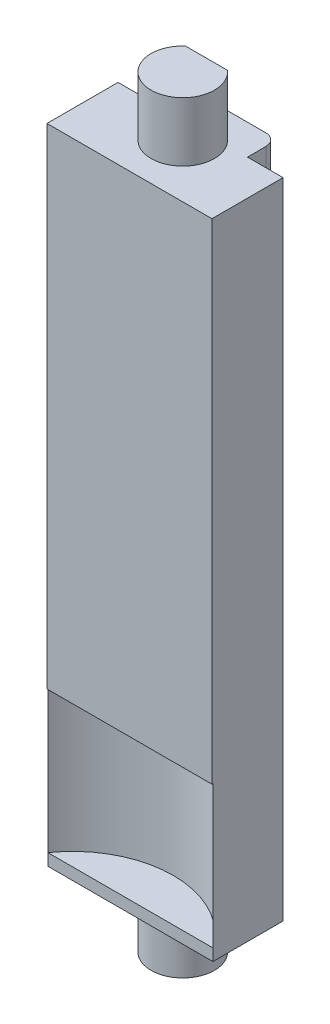
ISO-10303-21;
HEADER;
FILE_DESCRIPTION(('STEP AP214'),'2;1');
FILE_NAME('part.step','',(''),(''),'','','');
FILE_SCHEMA(('AUTOMOTIVE_DESIGN { 1 0 10303 214 1 1 1 1 }'));
ENDSEC;
DATA;
#1=APPLICATION_CONTEXT('core data for automotive mechanical design processes');
#2=APPLICATION_PROTOCOL_DEFINITION('international standard','automotive_design',2000,#1);
#3=PRODUCT_CONTEXT('',#1,'mechanical');
#4=PRODUCT('Part','Part','',(#3));
#5=PRODUCT_RELATED_PRODUCT_CATEGORY('part','',(#4));
#6=PRODUCT_DEFINITION_FORMATION('','',#4);
#7=PRODUCT_DEFINITION_CONTEXT('part definition',#1,'design');
#8=PRODUCT_DEFINITION('design','',#6,#7);
#9=PRODUCT_DEFINITION_SHAPE('','',#8);
#10=(LENGTH_UNIT() NAMED_UNIT(*) SI_UNIT(.MILLI.,.METRE.));
#11=(NAMED_UNIT(*) PLANE_ANGLE_UNIT() SI_UNIT($,.RADIAN.));
#12=(NAMED_UNIT(*) SI_UNIT($,.STERADIAN.) SOLID_ANGLE_UNIT());
#13=UNCERTAINTY_MEASURE_WITH_UNIT(LENGTH_MEASURE(1.E-05),#10,'distance_accuracy_value','');
#14=(GEOMETRIC_REPRESENTATION_CONTEXT(3) GLOBAL_UNCERTAINTY_ASSIGNED_CONTEXT((#13)) GLOBAL_UNIT_ASSIGNED_CONTEXT((#10,
#11,#12)) REPRESENTATION_CONTEXT('',''));
#15=CARTESIAN_POINT('',(0.,0.,0.));
#16=DIRECTION('',(0.,0.,1.));
#17=DIRECTION('',(1.,0.,0.));
#18=AXIS2_PLACEMENT_3D('',#15,#16,#17);
#19=CARTESIAN_POINT('',(0.,54.32,8.55));
#20=DIRECTION('',(0.,0.,-1.));
#21=DIRECTION('',(-1.,0.,0.));
#22=AXIS2_PLACEMENT_3D('',#19,#20,#21);
#23=PLANE('',#22);
#24=DIRECTION('',(-1.,0.,0.));
#25=VECTOR('',#24,1.);
#26=CARTESIAN_POINT('',(0.,13.,8.55));
#27=LINE('',#26,#25);
#28=CARTESIAN_POINT('',(10.92,13.,8.55));
#29=VERTEX_POINT('',#28);
#30=CARTESIAN_POINT('',(-3.,13.,8.55));
#31=VERTEX_POINT('',#30);
#32=EDGE_CURVE('E186',#29,#31,#27,.T.);
#33=ORIENTED_EDGE('',*,*,#32,.F.);
#34=DIRECTION('',(0.,-1.,0.));
#35=VECTOR('',#34,1.);
#36=CARTESIAN_POINT('',(10.92,54.32,8.55));
#37=LINE('',#36,#35);
#38=CARTESIAN_POINT('',(10.92,54.32,8.55));
#39=VERTEX_POINT('',#38);
#40=EDGE_CURVE('E254',#39,#29,#37,.T.);
#41=ORIENTED_EDGE('',*,*,#40,.F.);
#42=DIRECTION('',(1.,0.,0.));
#43=VECTOR('',#42,1.);
#44=CARTESIAN_POINT('',(0.,54.32,8.55));
#45=LINE('',#44,#43);
#46=CARTESIAN_POINT('',(-3.,54.32,8.55));
#47=VERTEX_POINT('',#46);
#48=EDGE_CURVE('E236',#47,#39,#45,.T.);
#49=ORIENTED_EDGE('',*,*,#48,.F.);
#50=DIRECTION('',(0.,-1.,0.));
#51=VECTOR('',#50,1.);
#52=CARTESIAN_POINT('',(-3.,54.32,8.55));
#53=LINE('',#52,#51);
#54=EDGE_CURVE('E257',#47,#31,#53,.T.);
#55=ORIENTED_EDGE('',*,*,#54,.T.);
#56=EDGE_LOOP('',(#33,#41,#49,#55));
#57=FACE_BOUND('',#56,.T.);
#58=ADVANCED_FACE('F37',(#57),#23,.F.);
#59=CARTESIAN_POINT('',(0.,0.,0.));
#60=DIRECTION('',(0.,1.,0.));
#61=DIRECTION('',(0.,0.,1.));
#62=AXIS2_PLACEMENT_3D('',#59,#60,#61);
#63=PLANE('',#62);
#64=CARTESIAN_POINT('',(3.96,0.,4.05));
#65=DIRECTION('',(0.,1.,0.));
#66=DIRECTION('',(0.,0.,1.));
#67=AXIS2_PLACEMENT_3D('',#64,#65,#66);
#68=CIRCLE('',#67,2.675);
#69=CARTESIAN_POINT('',(2.18359210765095,0.,2.05));
#70=VERTEX_POINT('',#69);
#71=CARTESIAN_POINT('',(5.73640789234905,0.,2.05));
#72=VERTEX_POINT('',#71);
#73=EDGE_CURVE('E196',#70,#72,#68,.T.);
#74=ORIENTED_EDGE('',*,*,#73,.T.);
#75=DIRECTION('',(1.,0.,0.));
#76=VECTOR('',#75,1.);
#77=CARTESIAN_POINT('',(0.,0.,2.05));
#78=LINE('',#77,#76);
#79=EDGE_CURVE('E192',#70,#72,#78,.T.);
#80=ORIENTED_EDGE('',*,*,#79,.F.);
#81=EDGE_LOOP('',(#74,#80));
#82=FACE_BOUND('',#81,.T.);
#83=DIRECTION('',(0.,0.,-1.));
#84=VECTOR('',#83,1.);
#85=CARTESIAN_POINT('',(10.92,0.,0.));
#86=LINE('',#85,#84);
#87=CARTESIAN_POINT('',(10.92,0.,8.46909948526199));
#88=VERTEX_POINT('',#87);
#89=CARTESIAN_POINT('',(10.92,0.,2.55));
#90=VERTEX_POINT('',#89);
#91=EDGE_CURVE('E154',#88,#90,#86,.T.);
#92=ORIENTED_EDGE('',*,*,#91,.F.);
#93=DIRECTION('',(1.,0.,0.));
#94=VECTOR('',#93,1.);
#95=CARTESIAN_POINT('',(-3.,0.,8.46909948526199));
#96=LINE('',#95,#94);
#97=CARTESIAN_POINT('',(-3.,0.,8.46909948526199));
#98=VERTEX_POINT('',#97);
#99=EDGE_CURVE('E159',#98,#88,#96,.T.);
#100=ORIENTED_EDGE('',*,*,#99,.F.);
#101=DIRECTION('',(0.,0.,1.));
#102=VECTOR('',#101,1.);
#103=CARTESIAN_POINT('',(-3.,0.,0.));
#104=LINE('',#103,#102);
#105=CARTESIAN_POINT('',(-3.,0.,2.55));
#106=VERTEX_POINT('',#105);
#107=EDGE_CURVE('E165',#106,#98,#104,.T.);
#108=ORIENTED_EDGE('',*,*,#107,.F.);
#109=DIRECTION('',(-1.,0.,0.));
#110=VECTOR('',#109,1.);
#111=CARTESIAN_POINT('',(0.,0.,2.55));
#112=LINE('',#111,#110);
#113=CARTESIAN_POINT('',(0.,0.,2.55));
#114=VERTEX_POINT('',#113);
#115=EDGE_CURVE('E246',#114,#106,#112,.T.);
#116=ORIENTED_EDGE('',*,*,#115,.F.);
#117=DIRECTION('',(0.,0.,1.));
#118=VECTOR('',#117,1.);
#119=CARTESIAN_POINT('',(0.,0.,0.));
#120=LINE('',#119,#118);
#121=CARTESIAN_POINT('',(0.,0.,1.));
#122=VERTEX_POINT('',#121);
#123=EDGE_CURVE('E244',#122,#114,#120,.T.);
#124=ORIENTED_EDGE('',*,*,#123,.F.);
#125=CARTESIAN_POINT('',(1.,0.,1.));
#126=DIRECTION('',(0.,1.,0.));
#127=DIRECTION('',(0.,0.,1.));
#128=AXIS2_PLACEMENT_3D('',#125,#126,#127);
#129=CIRCLE('',#128,1.);
#130=CARTESIAN_POINT('',(1.,0.,0.));
#131=VERTEX_POINT('',#130);
#132=EDGE_CURVE('E271',#122,#131,#129,.F.);
#133=ORIENTED_EDGE('',*,*,#132,.T.);
#134=DIRECTION('',(1.,0.,0.));
#135=VECTOR('',#134,1.);
#136=CARTESIAN_POINT('',(0.,0.,0.));
#137=LINE('',#136,#135);
#138=CARTESIAN_POINT('',(6.92,0.,0.));
#139=VERTEX_POINT('',#138);
#140=EDGE_CURVE('E241',#131,#139,#137,.T.);
#141=ORIENTED_EDGE('',*,*,#140,.T.);
#142=CARTESIAN_POINT('',(6.92,0.,1.));
#143=DIRECTION('',(0.,1.,0.));
#144=DIRECTION('',(0.,0.,1.));
#145=AXIS2_PLACEMENT_3D('',#142,#143,#144);
#146=CIRCLE('',#145,1.);
#147=CARTESIAN_POINT('',(7.92,0.,1.));
#148=VERTEX_POINT('',#147);
#149=EDGE_CURVE('E273',#139,#148,#146,.F.);
#150=ORIENTED_EDGE('',*,*,#149,.T.);
#151=DIRECTION('',(0.,0.,1.));
#152=VECTOR('',#151,1.);
#153=CARTESIAN_POINT('',(7.92,0.,0.));
#154=LINE('',#153,#152);
#155=CARTESIAN_POINT('',(7.92,0.,2.55));
#156=VERTEX_POINT('',#155);
#157=EDGE_CURVE('E223',#148,#156,#154,.T.);
#158=ORIENTED_EDGE('',*,*,#157,.T.);
#159=EDGE_CURVE('E161',#90,#156,#112,.T.);
#160=ORIENTED_EDGE('',*,*,#159,.F.);
#161=EDGE_LOOP('',(#92,#100,#108,#116,#124,#133,#141,#150,#158,#160));
#162=FACE_BOUND('',#161,.T.);
#163=ADVANCED_FACE('F156',(#82,#162),#63,.F.);
#164=CARTESIAN_POINT('',(7.92,54.32,0.));
#165=DIRECTION('',(1.,0.,0.));
#166=DIRECTION('',(0.,0.,-1.));
#167=AXIS2_PLACEMENT_3D('',#164,#165,#166);
#168=PLANE('',#167);
#169=ORIENTED_EDGE('',*,*,#157,.F.);
#170=DIRECTION('',(0.,-1.,0.));
#171=VECTOR('',#170,1.);
#172=CARTESIAN_POINT('',(7.92,54.32,1.));
#173=LINE('',#172,#171);
#174=CARTESIAN_POINT('',(7.92,54.32,1.));
#175=VERTEX_POINT('',#174);
#176=EDGE_CURVE('E275',#148,#175,#173,.F.);
#177=ORIENTED_EDGE('',*,*,#176,.T.);
#178=DIRECTION('',(0.,0.,1.));
#179=VECTOR('',#178,1.);
#180=CARTESIAN_POINT('',(7.92,54.32,0.));
#181=LINE('',#180,#179);
#182=CARTESIAN_POINT('',(7.92,54.32,2.55));
#183=VERTEX_POINT('',#182);
#184=EDGE_CURVE('E224',#175,#183,#181,.T.);
#185=ORIENTED_EDGE('',*,*,#184,.T.);
#186=DIRECTION('',(0.,-1.,0.));
#187=VECTOR('',#186,1.);
#188=CARTESIAN_POINT('',(7.92,54.32,2.55));
#189=LINE('',#188,#187);
#190=EDGE_CURVE('E249',#183,#156,#189,.T.);
#191=ORIENTED_EDGE('',*,*,#190,.T.);
#192=EDGE_LOOP('',(#169,#177,#185,#191));
#193=FACE_BOUND('',#192,.T.);
#194=ADVANCED_FACE('F320',(#193),#168,.T.);
#195=CARTESIAN_POINT('',(0.,54.32,0.));
#196=DIRECTION('',(0.,0.,-1.));
#197=DIRECTION('',(-1.,0.,0.));
#198=AXIS2_PLACEMENT_3D('',#195,#196,#197);
#199=PLANE('',#198);
#200=DIRECTION('',(1.,0.,0.));
#201=VECTOR('',#200,1.);
#202=CARTESIAN_POINT('',(0.,54.32,0.));
#203=LINE('',#202,#201);
#204=CARTESIAN_POINT('',(1.,54.32,0.));
#205=VERTEX_POINT('',#204);
#206=CARTESIAN_POINT('',(6.92,54.32,0.));
#207=VERTEX_POINT('',#206);
#208=EDGE_CURVE('E226',#205,#207,#203,.T.);
#209=ORIENTED_EDGE('',*,*,#208,.T.);
#210=DIRECTION('',(0.,-1.,0.));
#211=VECTOR('',#210,1.);
#212=CARTESIAN_POINT('',(6.92,54.32,0.));
#213=LINE('',#212,#211);
#214=EDGE_CURVE('E268',#207,#139,#213,.T.);
#215=ORIENTED_EDGE('',*,*,#214,.T.);
#216=ORIENTED_EDGE('',*,*,#140,.F.);
#217=DIRECTION('',(0.,-1.,0.));
#218=VECTOR('',#217,1.);
#219=CARTESIAN_POINT('',(1.,54.32,0.));
#220=LINE('',#219,#218);
#221=EDGE_CURVE('E266',#131,#205,#220,.F.);
#222=ORIENTED_EDGE('',*,*,#221,.T.);
#223=EDGE_LOOP('',(#209,#215,#216,#222));
#224=FACE_BOUND('',#223,.T.);
#225=ADVANCED_FACE('F332',(#224),#199,.T.);
#226=CARTESIAN_POINT('',(0.,54.32,0.));
#227=DIRECTION('',(1.,0.,0.));
#228=DIRECTION('',(0.,0.,-1.));
#229=AXIS2_PLACEMENT_3D('',#226,#227,#228);
#230=PLANE('',#229);
#231=DIRECTION('',(0.,0.,1.));
#232=VECTOR('',#231,1.);
#233=CARTESIAN_POINT('',(0.,54.32,0.));
#234=LINE('',#233,#232);
#235=CARTESIAN_POINT('',(0.,54.32,1.));
#236=VERTEX_POINT('',#235);
#237=CARTESIAN_POINT('',(0.,54.32,2.55));
#238=VERTEX_POINT('',#237);
#239=EDGE_CURVE('E229',#236,#238,#234,.T.);
#240=ORIENTED_EDGE('',*,*,#239,.F.);
#241=DIRECTION('',(0.,-1.,0.));
#242=VECTOR('',#241,1.);
#243=CARTESIAN_POINT('',(0.,0.,1.));
#244=LINE('',#243,#242);
#245=EDGE_CURVE('E281',#236,#122,#244,.T.);
#246=ORIENTED_EDGE('',*,*,#245,.T.);
#247=ORIENTED_EDGE('',*,*,#123,.T.);
#248=DIRECTION('',(0.,-1.,0.));
#249=VECTOR('',#248,1.);
#250=CARTESIAN_POINT('',(0.,54.32,2.55));
#251=LINE('',#250,#249);
#252=EDGE_CURVE('E263',#238,#114,#251,.T.);
#253=ORIENTED_EDGE('',*,*,#252,.F.);
#254=EDGE_LOOP('',(#240,#246,#247,#253));
#255=FACE_BOUND('',#254,.T.);
#256=ADVANCED_FACE('F329',(#255),#230,.F.);
#257=CARTESIAN_POINT('',(0.,54.32,2.55));
#258=DIRECTION('',(0.,0.,1.));
#259=DIRECTION('',(1.,0.,0.));
#260=AXIS2_PLACEMENT_3D('',#257,#258,#259);
#261=PLANE('',#260);
#262=ORIENTED_EDGE('',*,*,#115,.T.);
#263=DIRECTION('',(0.,-1.,0.));
#264=VECTOR('',#263,1.);
#265=CARTESIAN_POINT('',(-3.,54.32,2.55));
#266=LINE('',#265,#264);
#267=CARTESIAN_POINT('',(-3.,54.32,2.55));
#268=VERTEX_POINT('',#267);
#269=EDGE_CURVE('E260',#268,#106,#266,.T.);
#270=ORIENTED_EDGE('',*,*,#269,.F.);
#271=DIRECTION('',(-1.,0.,0.));
#272=VECTOR('',#271,1.);
#273=CARTESIAN_POINT('',(0.,54.32,2.55));
#274=LINE('',#273,#272);
#275=EDGE_CURVE('E231',#238,#268,#274,.T.);
#276=ORIENTED_EDGE('',*,*,#275,.F.);
#277=ORIENTED_EDGE('',*,*,#252,.T.);
#278=EDGE_LOOP('',(#262,#270,#276,#277));
#279=FACE_BOUND('',#278,.T.);
#280=ADVANCED_FACE('F328',(#279),#261,.F.);
#281=CARTESIAN_POINT('',(-3.,54.32,0.));
#282=DIRECTION('',(1.,0.,0.));
#283=DIRECTION('',(0.,0.,-1.));
#284=AXIS2_PLACEMENT_3D('',#281,#282,#283);
#285=PLANE('',#284);
#286=ORIENTED_EDGE('',*,*,#107,.T.);
#287=DIRECTION('',(0.,-1.,0.));
#288=VECTOR('',#287,1.);
#289=CARTESIAN_POINT('',(-3.,13.,8.46909948526199));
#290=LINE('',#289,#288);
#291=CARTESIAN_POINT('',(-3.,1.,8.46909948526199));
#292=VERTEX_POINT('',#291);
#293=EDGE_CURVE('E179',#98,#292,#290,.F.);
#294=ORIENTED_EDGE('',*,*,#293,.T.);
#295=CARTESIAN_POINT('',(-3.,13.,8.46909948526199));
#296=VERTEX_POINT('',#295);
#297=EDGE_CURVE('E52',#292,#296,#290,.F.);
#298=ORIENTED_EDGE('',*,*,#297,.T.);
#299=DIRECTION('',(0.,0.,-1.));
#300=VECTOR('',#299,1.);
#301=CARTESIAN_POINT('',(-3.,13.,0.));
#302=LINE('',#301,#300);
#303=EDGE_CURVE('E188',#31,#296,#302,.T.);
#304=ORIENTED_EDGE('',*,*,#303,.F.);
#305=ORIENTED_EDGE('',*,*,#54,.F.);
#306=DIRECTION('',(0.,0.,1.));
#307=VECTOR('',#306,1.);
#308=CARTESIAN_POINT('',(-3.,54.32,0.));
#309=LINE('',#308,#307);
#310=EDGE_CURVE('E233',#268,#47,#309,.T.);
#311=ORIENTED_EDGE('',*,*,#310,.F.);
#312=ORIENTED_EDGE('',*,*,#269,.T.);
#313=EDGE_LOOP('',(#286,#294,#298,#304,#305,#311,#312));
#314=FACE_BOUND('',#313,.T.);
#315=ADVANCED_FACE('F302',(#314),#285,.F.);
#316=CARTESIAN_POINT('',(10.92,54.32,0.));
#317=DIRECTION('',(-1.,0.,0.));
#318=DIRECTION('',(0.,0.,1.));
#319=AXIS2_PLACEMENT_3D('',#316,#317,#318);
#320=PLANE('',#319);
#321=DIRECTION('',(0.,0.,1.));
#322=VECTOR('',#321,1.);
#323=CARTESIAN_POINT('',(10.92,13.,0.));
#324=LINE('',#323,#322);
#325=CARTESIAN_POINT('',(10.92,13.,8.46909948526199));
#326=VERTEX_POINT('',#325);
#327=EDGE_CURVE('E45',#326,#29,#324,.T.);
#328=ORIENTED_EDGE('',*,*,#327,.F.);
#329=DIRECTION('',(0.,-1.,0.));
#330=VECTOR('',#329,1.);
#331=CARTESIAN_POINT('',(10.92,13.,8.46909948526199));
#332=LINE('',#331,#330);
#333=CARTESIAN_POINT('',(10.92,1.,8.46909948526199));
#334=VERTEX_POINT('',#333);
#335=EDGE_CURVE('E11',#326,#334,#332,.T.);
#336=ORIENTED_EDGE('',*,*,#335,.T.);
#337=DIRECTION('',(0.,-1.,0.));
#338=VECTOR('',#337,1.);
#339=CARTESIAN_POINT('',(10.92,1.,8.46909948526199));
#340=LINE('',#339,#338);
#341=EDGE_CURVE('E168',#334,#88,#340,.T.);
#342=ORIENTED_EDGE('',*,*,#341,.T.);
#343=ORIENTED_EDGE('',*,*,#91,.T.);
#344=DIRECTION('',(0.,-1.,0.));
#345=VECTOR('',#344,1.);
#346=CARTESIAN_POINT('',(10.92,54.32,2.55));
#347=LINE('',#346,#345);
#348=CARTESIAN_POINT('',(10.92,54.32,2.55));
#349=VERTEX_POINT('',#348);
#350=EDGE_CURVE('E252',#349,#90,#347,.T.);
#351=ORIENTED_EDGE('',*,*,#350,.F.);
#352=DIRECTION('',(0.,0.,-1.));
#353=VECTOR('',#352,1.);
#354=CARTESIAN_POINT('',(10.92,54.32,0.));
#355=LINE('',#354,#353);
#356=EDGE_CURVE('E238',#39,#349,#355,.T.);
#357=ORIENTED_EDGE('',*,*,#356,.F.);
#358=ORIENTED_EDGE('',*,*,#40,.T.);
#359=EDGE_LOOP('',(#328,#336,#342,#343,#351,#357,#358));
#360=FACE_BOUND('',#359,.T.);
#361=ADVANCED_FACE('F170',(#360),#320,.F.);
#362=ORIENTED_EDGE('',*,*,#159,.T.);
#363=ORIENTED_EDGE('',*,*,#190,.F.);
#364=EDGE_CURVE('E234',#349,#183,#274,.T.);
#365=ORIENTED_EDGE('',*,*,#364,.F.);
#366=ORIENTED_EDGE('',*,*,#350,.T.);
#367=EDGE_LOOP('',(#362,#363,#365,#366));
#368=FACE_BOUND('',#367,.T.);
#369=ADVANCED_FACE('F348',(#368),#261,.F.);
#370=CARTESIAN_POINT('',(0.,54.32,0.));
#371=DIRECTION('',(0.,1.,0.));
#372=DIRECTION('',(0.,0.,1.));
#373=AXIS2_PLACEMENT_3D('',#370,#371,#372);
#374=PLANE('',#373);
#375=DIRECTION('',(1.,0.,0.));
#376=VECTOR('',#375,1.);
#377=CARTESIAN_POINT('',(0.,54.32,2.05));
#378=LINE('',#377,#376);
#379=CARTESIAN_POINT('',(2.18359210765095,54.32,2.05));
#380=VERTEX_POINT('',#379);
#381=CARTESIAN_POINT('',(5.73640789234905,54.32,2.05));
#382=VERTEX_POINT('',#381);
#383=EDGE_CURVE('E207',#380,#382,#378,.T.);
#384=ORIENTED_EDGE('',*,*,#383,.T.);
#385=CARTESIAN_POINT('',(3.96,54.32,4.05));
#386=DIRECTION('',(0.,1.,0.));
#387=DIRECTION('',(0.,0.,1.));
#388=AXIS2_PLACEMENT_3D('',#385,#386,#387);
#389=CIRCLE('',#388,2.675);
#390=EDGE_CURVE('E212',#380,#382,#389,.T.);
#391=ORIENTED_EDGE('',*,*,#390,.F.);
#392=EDGE_LOOP('',(#384,#391));
#393=FACE_BOUND('',#392,.T.);
#394=ORIENTED_EDGE('',*,*,#184,.F.);
#395=CARTESIAN_POINT('',(6.92,54.32,1.));
#396=DIRECTION('',(0.,1.,0.));
#397=DIRECTION('',(0.,0.,1.));
#398=AXIS2_PLACEMENT_3D('',#395,#396,#397);
#399=CIRCLE('',#398,1.);
#400=EDGE_CURVE('E279',#175,#207,#399,.T.);
#401=ORIENTED_EDGE('',*,*,#400,.T.);
#402=ORIENTED_EDGE('',*,*,#208,.F.);
#403=CARTESIAN_POINT('',(1.,54.32,1.));
#404=DIRECTION('',(0.,1.,0.));
#405=DIRECTION('',(0.,0.,1.));
#406=AXIS2_PLACEMENT_3D('',#403,#404,#405);
#407=CIRCLE('',#406,1.);
#408=EDGE_CURVE('E277',#205,#236,#407,.T.);
#409=ORIENTED_EDGE('',*,*,#408,.T.);
#410=ORIENTED_EDGE('',*,*,#239,.T.);
#411=ORIENTED_EDGE('',*,*,#275,.T.);
#412=ORIENTED_EDGE('',*,*,#310,.T.);
#413=ORIENTED_EDGE('',*,*,#48,.T.);
#414=ORIENTED_EDGE('',*,*,#356,.T.);
#415=ORIENTED_EDGE('',*,*,#364,.T.);
#416=EDGE_LOOP('',(#394,#401,#402,#409,#410,#411,#412,#413,#414,#415));
#417=FACE_BOUND('',#416,.T.);
#418=ADVANCED_FACE('F296',(#393,#417),#374,.T.);
#419=CARTESIAN_POINT('',(6.92,54.32,1.));
#420=DIRECTION('',(0.,-1.,0.));
#421=DIRECTION('',(0.,0.,-1.));
#422=AXIS2_PLACEMENT_3D('',#419,#420,#421);
#423=CYLINDRICAL_SURFACE('',#422,1.);
#424=ORIENTED_EDGE('',*,*,#400,.F.);
#425=ORIENTED_EDGE('',*,*,#176,.F.);
#426=ORIENTED_EDGE('',*,*,#149,.F.);
#427=ORIENTED_EDGE('',*,*,#214,.F.);
#428=EDGE_LOOP('',(#424,#425,#426,#427));
#429=FACE_BOUND('',#428,.T.);
#430=ADVANCED_FACE('F339',(#429),#423,.T.);
#431=CARTESIAN_POINT('',(1.,54.32,1.));
#432=DIRECTION('',(0.,1.,0.));
#433=DIRECTION('',(0.,0.,1.));
#434=AXIS2_PLACEMENT_3D('',#431,#432,#433);
#435=CYLINDRICAL_SURFACE('',#434,1.);
#436=ORIENTED_EDGE('',*,*,#408,.F.);
#437=ORIENTED_EDGE('',*,*,#221,.F.);
#438=ORIENTED_EDGE('',*,*,#132,.F.);
#439=ORIENTED_EDGE('',*,*,#245,.F.);
#440=EDGE_LOOP('',(#436,#437,#438,#439));
#441=FACE_BOUND('',#440,.T.);
#442=ADVANCED_FACE('F39',(#441),#435,.T.);
#443=CARTESIAN_POINT('',(0.,59.32,2.05));
#444=DIRECTION('',(0.,0.,-1.));
#445=DIRECTION('',(-1.,0.,0.));
#446=AXIS2_PLACEMENT_3D('',#443,#444,#445);
#447=PLANE('',#446);
#448=ORIENTED_EDGE('',*,*,#383,.F.);
#449=DIRECTION('',(0.,-1.,0.));
#450=VECTOR('',#449,1.);
#451=CARTESIAN_POINT('',(2.18359210765095,59.32,2.05));
#452=LINE('',#451,#450);
#453=CARTESIAN_POINT('',(2.18359210765095,59.32,2.05));
#454=VERTEX_POINT('',#453);
#455=EDGE_CURVE('E220',#454,#380,#452,.T.);
#456=ORIENTED_EDGE('',*,*,#455,.F.);
#457=DIRECTION('',(1.,0.,0.));
#458=VECTOR('',#457,1.);
#459=CARTESIAN_POINT('',(0.,59.32,2.05));
#460=LINE('',#459,#458);
#461=CARTESIAN_POINT('',(5.73640789234905,59.32,2.05));
#462=VERTEX_POINT('',#461);
#463=EDGE_CURVE('E208',#454,#462,#460,.T.);
#464=ORIENTED_EDGE('',*,*,#463,.T.);
#465=DIRECTION('',(0.,-1.,0.));
#466=VECTOR('',#465,1.);
#467=CARTESIAN_POINT('',(5.73640789234905,59.32,2.05));
#468=LINE('',#467,#466);
#469=EDGE_CURVE('E214',#462,#382,#468,.T.);
#470=ORIENTED_EDGE('',*,*,#469,.T.);
#471=EDGE_LOOP('',(#448,#456,#464,#470));
#472=FACE_BOUND('',#471,.T.);
#473=ADVANCED_FACE('F346',(#472),#447,.T.);
#474=CARTESIAN_POINT('',(3.96,59.32,4.05));
#475=DIRECTION('',(0.,-1.,0.));
#476=DIRECTION('',(0.,0.,-1.));
#477=AXIS2_PLACEMENT_3D('',#474,#475,#476);
#478=CYLINDRICAL_SURFACE('',#477,2.675);
#479=ORIENTED_EDGE('',*,*,#390,.T.);
#480=ORIENTED_EDGE('',*,*,#469,.F.);
#481=CARTESIAN_POINT('',(3.96,59.32,4.05));
#482=DIRECTION('',(0.,1.,0.));
#483=DIRECTION('',(0.,0.,1.));
#484=AXIS2_PLACEMENT_3D('',#481,#482,#483);
#485=CIRCLE('',#484,2.675);
#486=EDGE_CURVE('E211',#454,#462,#485,.T.);
#487=ORIENTED_EDGE('',*,*,#486,.F.);
#488=ORIENTED_EDGE('',*,*,#455,.T.);
#489=EDGE_LOOP('',(#479,#480,#487,#488));
#490=FACE_BOUND('',#489,.T.);
#491=ADVANCED_FACE('F476',(#490),#478,.T.);
#492=CARTESIAN_POINT('',(0.,59.32,0.));
#493=DIRECTION('',(0.,1.,0.));
#494=DIRECTION('',(0.,0.,1.));
#495=AXIS2_PLACEMENT_3D('',#492,#493,#494);
#496=PLANE('',#495);
#497=ORIENTED_EDGE('',*,*,#463,.F.);
#498=ORIENTED_EDGE('',*,*,#486,.T.);
#499=EDGE_LOOP('',(#497,#498));
#500=FACE_BOUND('',#499,.T.);
#501=ADVANCED_FACE('F486',(#500),#496,.T.);
#502=CARTESIAN_POINT('',(0.,-5.,2.05));
#503=DIRECTION('',(0.,0.,1.));
#504=DIRECTION('',(1.,0.,0.));
#505=AXIS2_PLACEMENT_3D('',#502,#503,#504);
#506=PLANE('',#505);
#507=ORIENTED_EDGE('',*,*,#79,.T.);
#508=DIRECTION('',(0.,1.,0.));
#509=VECTOR('',#508,1.);
#510=CARTESIAN_POINT('',(5.73640789234905,-5.,2.05));
#511=LINE('',#510,#509);
#512=CARTESIAN_POINT('',(5.73640789234905,-5.,2.05));
#513=VERTEX_POINT('',#512);
#514=EDGE_CURVE('E204',#513,#72,#511,.T.);
#515=ORIENTED_EDGE('',*,*,#514,.F.);
#516=DIRECTION('',(1.,0.,0.));
#517=VECTOR('',#516,1.);
#518=CARTESIAN_POINT('',(0.,-5.,2.05));
#519=LINE('',#518,#517);
#520=CARTESIAN_POINT('',(2.18359210765095,-5.,2.05));
#521=VERTEX_POINT('',#520);
#522=EDGE_CURVE('E193',#521,#513,#519,.T.);
#523=ORIENTED_EDGE('',*,*,#522,.F.);
#524=DIRECTION('',(0.,1.,0.));
#525=VECTOR('',#524,1.);
#526=CARTESIAN_POINT('',(2.18359210765095,-5.,2.05));
#527=LINE('',#526,#525);
#528=EDGE_CURVE('E199',#521,#70,#527,.T.);
#529=ORIENTED_EDGE('',*,*,#528,.T.);
#530=EDGE_LOOP('',(#507,#515,#523,#529));
#531=FACE_BOUND('',#530,.T.);
#532=ADVANCED_FACE('F393',(#531),#506,.F.);
#533=CARTESIAN_POINT('',(3.96,-5.,4.05));
#534=DIRECTION('',(0.,1.,0.));
#535=DIRECTION('',(0.,0.,1.));
#536=AXIS2_PLACEMENT_3D('',#533,#534,#535);
#537=CYLINDRICAL_SURFACE('',#536,2.675);
#538=ORIENTED_EDGE('',*,*,#73,.F.);
#539=ORIENTED_EDGE('',*,*,#528,.F.);
#540=CARTESIAN_POINT('',(3.96,-5.,4.05));
#541=DIRECTION('',(0.,1.,0.));
#542=DIRECTION('',(0.,0.,1.));
#543=AXIS2_PLACEMENT_3D('',#540,#541,#542);
#544=CIRCLE('',#543,2.675);
#545=EDGE_CURVE('E195',#521,#513,#544,.T.);
#546=ORIENTED_EDGE('',*,*,#545,.T.);
#547=ORIENTED_EDGE('',*,*,#514,.T.);
#548=EDGE_LOOP('',(#538,#539,#546,#547));
#549=FACE_BOUND('',#548,.T.);
#550=ADVANCED_FACE('F312',(#549),#537,.T.);
#551=CARTESIAN_POINT('',(0.,-5.,0.));
#552=DIRECTION('',(0.,-1.,0.));
#553=DIRECTION('',(0.,0.,1.));
#554=AXIS2_PLACEMENT_3D('',#551,#552,#553);
#555=PLANE('',#554);
#556=ORIENTED_EDGE('',*,*,#522,.T.);
#557=ORIENTED_EDGE('',*,*,#545,.F.);
#558=EDGE_LOOP('',(#556,#557));
#559=FACE_BOUND('',#558,.T.);
#560=ADVANCED_FACE('F305',(#559),#555,.T.);
#561=CARTESIAN_POINT('',(3.96,13.,13.3484846924372));
#562=DIRECTION('',(0.,-1.,0.));
#563=DIRECTION('',(0.,0.,-1.));
#564=AXIS2_PLACEMENT_3D('',#561,#562,#563);
#565=CYLINDRICAL_SURFACE('',#564,8.5);
#566=ORIENTED_EDGE('',*,*,#297,.F.);
#567=CARTESIAN_POINT('',(3.96,1.,13.3484846924372));
#568=DIRECTION('',(0.,1.,0.));
#569=DIRECTION('',(0.,0.,1.));
#570=AXIS2_PLACEMENT_3D('',#567,#568,#569);
#571=CIRCLE('',#570,8.5);
#572=EDGE_CURVE('E57',#334,#292,#571,.T.);
#573=ORIENTED_EDGE('',*,*,#572,.F.);
#574=ORIENTED_EDGE('',*,*,#335,.F.);
#575=CARTESIAN_POINT('',(3.96,13.,13.3484846924372));
#576=DIRECTION('',(0.,-1.,0.));
#577=DIRECTION('',(0.,0.,-1.));
#578=AXIS2_PLACEMENT_3D('',#575,#576,#577);
#579=CIRCLE('',#578,8.5);
#580=EDGE_CURVE('E174',#296,#326,#579,.T.);
#581=ORIENTED_EDGE('',*,*,#580,.F.);
#582=EDGE_LOOP('',(#566,#573,#574,#581));
#583=FACE_BOUND('',#582,.T.);
#584=ADVANCED_FACE('F303',(#583),#565,.F.);
#585=CARTESIAN_POINT('',(3.96,13.,13.3484846924372));
#586=DIRECTION('',(0.,-1.,0.));
#587=DIRECTION('',(0.,0.,-1.));
#588=AXIS2_PLACEMENT_3D('',#585,#586,#587);
#589=PLANE('',#588);
#590=ORIENTED_EDGE('',*,*,#303,.T.);
#591=ORIENTED_EDGE('',*,*,#580,.T.);
#592=ORIENTED_EDGE('',*,*,#327,.T.);
#593=ORIENTED_EDGE('',*,*,#32,.T.);
#594=EDGE_LOOP('',(#590,#591,#592,#593));
#595=FACE_BOUND('',#594,.T.);
#596=ADVANCED_FACE('F285',(#595),#589,.T.);
#597=CARTESIAN_POINT('',(-3.,1.,8.46909948526199));
#598=DIRECTION('',(0.,0.,-1.));
#599=DIRECTION('',(-1.,0.,0.));
#600=AXIS2_PLACEMENT_3D('',#597,#598,#599);
#601=PLANE('',#600);
#602=ORIENTED_EDGE('',*,*,#99,.T.);
#603=ORIENTED_EDGE('',*,*,#341,.F.);
#604=DIRECTION('',(1.,0.,0.));
#605=VECTOR('',#604,1.);
#606=CARTESIAN_POINT('',(-3.,1.,8.46909948526199));
#607=LINE('',#606,#605);
#608=EDGE_CURVE('E175',#292,#334,#607,.T.);
#609=ORIENTED_EDGE('',*,*,#608,.F.);
#610=ORIENTED_EDGE('',*,*,#293,.F.);
#611=EDGE_LOOP('',(#602,#603,#609,#610));
#612=FACE_BOUND('',#611,.T.);
#613=ADVANCED_FACE('F178',(#612),#601,.F.);
#614=CARTESIAN_POINT('',(3.96,1.,13.3484846924372));
#615=DIRECTION('',(0.,1.,0.));
#616=DIRECTION('',(0.,0.,1.));
#617=AXIS2_PLACEMENT_3D('',#614,#615,#616);
#618=PLANE('',#617);
#619=ORIENTED_EDGE('',*,*,#572,.T.);
#620=ORIENTED_EDGE('',*,*,#608,.T.);
#621=EDGE_LOOP('',(#619,#620));
#622=FACE_BOUND('',#621,.T.);
#623=ADVANCED_FACE('F413',(#622),#618,.T.);
#624=CLOSED_SHELL('',(#58,#163,#194,#225,#256,#280,#315,#361,#369,#418,#430,#442,#473,#491,#501,
#532,#550,#560,#584,#596,#613,#623));
#625=MANIFOLD_SOLID_BREP('B2',#624);
#626=ADVANCED_BREP_SHAPE_REPRESENTATION('',(#18,#625),#14);
#627=SHAPE_DEFINITION_REPRESENTATION(#9,#626);
ENDSEC;
END-ISO-10303-21;
